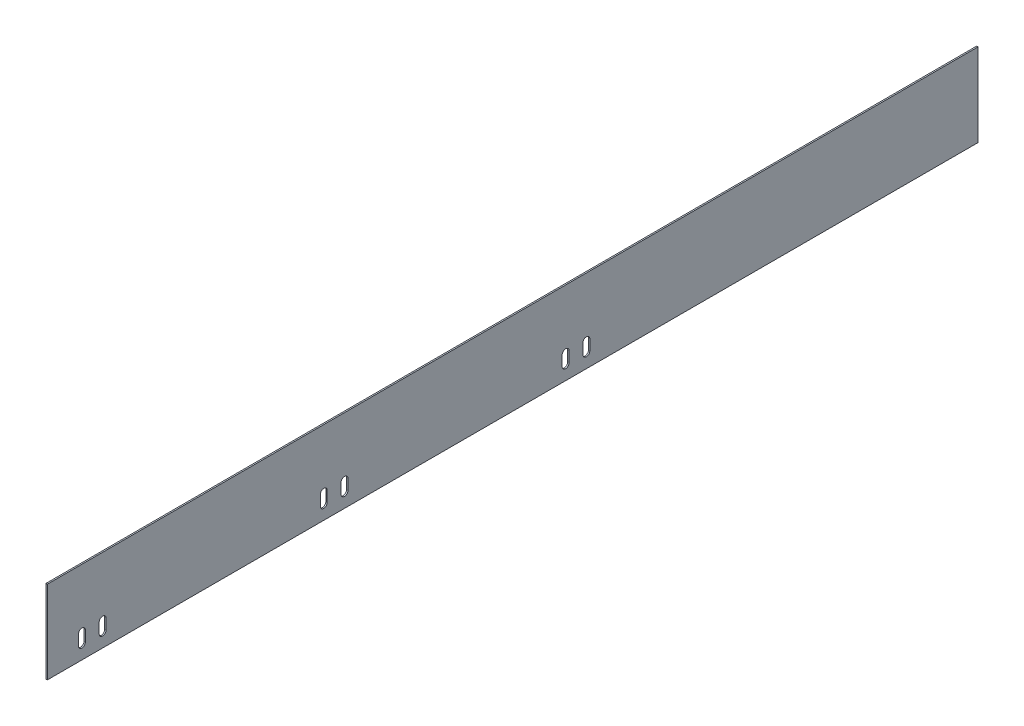
ISO-10303-21;
HEADER;
FILE_DESCRIPTION(('STEP AP214'),'2;1');
FILE_NAME('part.step','',(''),(''),'','','');
FILE_SCHEMA(('AUTOMOTIVE_DESIGN { 1 0 10303 214 1 1 1 1 }'));
ENDSEC;
DATA;
#1=APPLICATION_CONTEXT('core data for automotive mechanical design processes');
#2=APPLICATION_PROTOCOL_DEFINITION('international standard','automotive_design',2000,#1);
#3=PRODUCT_CONTEXT('',#1,'mechanical');
#4=PRODUCT('Part','Part','',(#3));
#5=PRODUCT_RELATED_PRODUCT_CATEGORY('part','',(#4));
#6=PRODUCT_DEFINITION_FORMATION('','',#4);
#7=PRODUCT_DEFINITION_CONTEXT('part definition',#1,'design');
#8=PRODUCT_DEFINITION('design','',#6,#7);
#9=PRODUCT_DEFINITION_SHAPE('','',#8);
#10=(LENGTH_UNIT() NAMED_UNIT(*) SI_UNIT(.MILLI.,.METRE.));
#11=(NAMED_UNIT(*) PLANE_ANGLE_UNIT() SI_UNIT($,.RADIAN.));
#12=(NAMED_UNIT(*) SI_UNIT($,.STERADIAN.) SOLID_ANGLE_UNIT());
#13=UNCERTAINTY_MEASURE_WITH_UNIT(LENGTH_MEASURE(1.E-05),#10,'distance_accuracy_value','');
#14=(GEOMETRIC_REPRESENTATION_CONTEXT(3) GLOBAL_UNCERTAINTY_ASSIGNED_CONTEXT((#13)) GLOBAL_UNIT_ASSIGNED_CONTEXT((#10,
#11,#12)) REPRESENTATION_CONTEXT('',''));
#15=CARTESIAN_POINT('',(0.,0.,0.));
#16=DIRECTION('',(0.,0.,1.));
#17=DIRECTION('',(1.,0.,0.));
#18=AXIS2_PLACEMENT_3D('',#15,#16,#17);
#19=CARTESIAN_POINT('',(1.11022302462516E-13,60.0000000000001,-523.712388980384));
#20=DIRECTION('',(0.,1.,0.));
#21=DIRECTION('',(1.,0.,0.));
#22=AXIS2_PLACEMENT_3D('',#19,#20,#21);
#23=PLANE('',#22);
#24=DIRECTION('',(0.,0.,1.));
#25=VECTOR('',#24,1.);
#26=CARTESIAN_POINT('',(1.11022302462516E-13,60.0000000000001,-523.712388980384));
#27=LINE('',#26,#25);
#28=CARTESIAN_POINT('',(-1.88737914186277E-12,60.0000000000001,-821.712388980384));
#29=VERTEX_POINT('',#28);
#30=CARTESIAN_POINT('',(0.,60.0000000000001,525.000000000001));
#31=VERTEX_POINT('',#30);
#32=EDGE_CURVE('E102',#29,#31,#27,.T.);
#33=ORIENTED_EDGE('',*,*,#32,.T.);
#34=DIRECTION('',(-1.,0.,0.));
#35=VECTOR('',#34,1.);
#36=CARTESIAN_POINT('',(2.,60.0000000000001,525.000000000001));
#37=LINE('',#36,#35);
#38=CARTESIAN_POINT('',(2.,60.0000000000001,525.000000000001));
#39=VERTEX_POINT('',#38);
#40=EDGE_CURVE('E276',#39,#31,#37,.T.);
#41=ORIENTED_EDGE('',*,*,#40,.F.);
#42=DIRECTION('',(0.,0.,-1.));
#43=VECTOR('',#42,1.);
#44=CARTESIAN_POINT('',(2.00000000000011,60.0000000000001,-521.712388980383));
#45=LINE('',#44,#43);
#46=CARTESIAN_POINT('',(1.99999999999811,60.0000000000001,-821.712388980384));
#47=VERTEX_POINT('',#46);
#48=EDGE_CURVE('E269',#47,#39,#45,.F.);
#49=ORIENTED_EDGE('',*,*,#48,.F.);
#50=DIRECTION('',(1.,0.,0.));
#51=VECTOR('',#50,1.);
#52=CARTESIAN_POINT('',(-1.88737914186277E-12,60.0000000000001,-821.712388980384));
#53=LINE('',#52,#51);
#54=EDGE_CURVE('E13',#29,#47,#53,.T.);
#55=ORIENTED_EDGE('',*,*,#54,.F.);
#56=EDGE_LOOP('',(#33,#41,#49,#55));
#57=FACE_BOUND('',#56,.T.);
#58=ADVANCED_FACE('F63',(#57),#23,.T.);
#59=CARTESIAN_POINT('',(-1.88737914186277E-12,-60.0000000000001,-821.712388980384));
#60=DIRECTION('',(0.,-1.,0.));
#61=DIRECTION('',(-1.,0.,0.));
#62=AXIS2_PLACEMENT_3D('',#59,#60,#61);
#63=PLANE('',#62);
#64=DIRECTION('',(0.,0.,1.));
#65=VECTOR('',#64,1.);
#66=CARTESIAN_POINT('',(2.00000000000011,-60.0000000000001,-521.712388980383));
#67=LINE('',#66,#65);
#68=CARTESIAN_POINT('',(2.,-60.0000000000001,525.000000000001));
#69=VERTEX_POINT('',#68);
#70=CARTESIAN_POINT('',(1.99999999999811,-60.0000000000001,-821.712388980384));
#71=VERTEX_POINT('',#70);
#72=EDGE_CURVE('E67',#69,#71,#67,.F.);
#73=ORIENTED_EDGE('',*,*,#72,.F.);
#74=DIRECTION('',(-1.,0.,0.));
#75=VECTOR('',#74,1.);
#76=CARTESIAN_POINT('',(2.,-60.0000000000001,525.000000000001));
#77=LINE('',#76,#75);
#78=CARTESIAN_POINT('',(0.,-60.0000000000001,525.000000000001));
#79=VERTEX_POINT('',#78);
#80=EDGE_CURVE('E275',#69,#79,#77,.T.);
#81=ORIENTED_EDGE('',*,*,#80,.T.);
#82=DIRECTION('',(0.,0.,-1.));
#83=VECTOR('',#82,1.);
#84=CARTESIAN_POINT('',(-1.88737914186277E-12,-60.0000000000001,-821.712388980384));
#85=LINE('',#84,#83);
#86=CARTESIAN_POINT('',(-1.88737914186277E-12,-60.0000000000001,-821.712388980384));
#87=VERTEX_POINT('',#86);
#88=EDGE_CURVE('E260',#79,#87,#85,.T.);
#89=ORIENTED_EDGE('',*,*,#88,.T.);
#90=DIRECTION('',(1.,0.,0.));
#91=VECTOR('',#90,1.);
#92=CARTESIAN_POINT('',(-1.88737914186277E-12,-60.0000000000001,-821.712388980384));
#93=LINE('',#92,#91);
#94=EDGE_CURVE('E74',#87,#71,#93,.T.);
#95=ORIENTED_EDGE('',*,*,#94,.T.);
#96=EDGE_LOOP('',(#73,#81,#89,#95));
#97=FACE_BOUND('',#96,.T.);
#98=ADVANCED_FACE('F279',(#97),#63,.T.);
#99=CARTESIAN_POINT('',(0.,0.,0.));
#100=DIRECTION('',(-1.,0.,0.));
#101=DIRECTION('',(0.,0.,1.));
#102=AXIS2_PLACEMENT_3D('',#99,#100,#101);
#103=PLANE('',#102);
#104=ORIENTED_EDGE('',*,*,#88,.F.);
#105=DIRECTION('',(0.,-1.,0.));
#106=VECTOR('',#105,1.);
#107=CARTESIAN_POINT('',(0.,-60.0000000000001,525.000000000001));
#108=LINE('',#107,#106);
#109=EDGE_CURVE('E263',#31,#79,#108,.T.);
#110=ORIENTED_EDGE('',*,*,#109,.F.);
#111=ORIENTED_EDGE('',*,*,#32,.F.);
#112=DIRECTION('',(0.,1.,0.));
#113=VECTOR('',#112,1.);
#114=CARTESIAN_POINT('',(-1.88737914186277E-12,60.0000000000001,-821.712388980384));
#115=LINE('',#114,#113);
#116=EDGE_CURVE('E264',#87,#29,#115,.T.);
#117=ORIENTED_EDGE('',*,*,#116,.F.);
#118=EDGE_LOOP('',(#104,#110,#111,#117));
#119=FACE_BOUND('',#118,.T.);
#120=CARTESIAN_POINT('',(0.,-25.0000000000001,475.000000000001));
#121=DIRECTION('',(-1.,0.,0.));
#122=DIRECTION('',(0.,0.,1.));
#123=AXIS2_PLACEMENT_3D('',#120,#121,#122);
#124=CIRCLE('',#123,5.);
#125=CARTESIAN_POINT('',(0.,-25.0000000000001,480.000000000001));
#126=VERTEX_POINT('',#125);
#127=CARTESIAN_POINT('',(0.,-25.0000000000001,470.000000000001));
#128=VERTEX_POINT('',#127);
#129=EDGE_CURVE('E298',#126,#128,#124,.T.);
#130=ORIENTED_EDGE('',*,*,#129,.F.);
#131=DIRECTION('',(0.,1.,0.));
#132=VECTOR('',#131,1.);
#133=CARTESIAN_POINT('',(0.,-25.0000000000001,480.000000000001));
#134=LINE('',#133,#132);
#135=CARTESIAN_POINT('',(0.,-40.0000000000001,480.000000000001));
#136=VERTEX_POINT('',#135);
#137=EDGE_CURVE('E286',#136,#126,#134,.T.);
#138=ORIENTED_EDGE('',*,*,#137,.F.);
#139=CARTESIAN_POINT('',(0.,-40.0000000000001,475.000000000001));
#140=DIRECTION('',(-1.,0.,0.));
#141=DIRECTION('',(0.,0.,1.));
#142=AXIS2_PLACEMENT_3D('',#139,#140,#141);
#143=CIRCLE('',#142,5.);
#144=CARTESIAN_POINT('',(0.,-40.0000000000001,470.000000000001));
#145=VERTEX_POINT('',#144);
#146=EDGE_CURVE('E318',#145,#136,#143,.T.);
#147=ORIENTED_EDGE('',*,*,#146,.F.);
#148=DIRECTION('',(0.,-1.,0.));
#149=VECTOR('',#148,1.);
#150=CARTESIAN_POINT('',(0.,-25.0000000000001,470.000000000001));
#151=LINE('',#150,#149);
#152=EDGE_CURVE('E307',#128,#145,#151,.T.);
#153=ORIENTED_EDGE('',*,*,#152,.F.);
#154=EDGE_LOOP('',(#130,#138,#147,#153));
#155=FACE_BOUND('',#154,.T.);
#156=CARTESIAN_POINT('',(0.,-25.0000000000003,445.000000000001));
#157=DIRECTION('',(-1.,0.,0.));
#158=DIRECTION('',(0.,0.,1.));
#159=AXIS2_PLACEMENT_3D('',#156,#157,#158);
#160=CIRCLE('',#159,5.);
#161=CARTESIAN_POINT('',(0.,-25.0000000000003,450.000000000001));
#162=VERTEX_POINT('',#161);
#163=CARTESIAN_POINT('',(0.,-25.0000000000003,440.000000000001));
#164=VERTEX_POINT('',#163);
#165=EDGE_CURVE('E339',#162,#164,#160,.T.);
#166=ORIENTED_EDGE('',*,*,#165,.F.);
#167=DIRECTION('',(0.,1.,0.));
#168=VECTOR('',#167,1.);
#169=CARTESIAN_POINT('',(0.,-25.0000000000003,450.000000000001));
#170=LINE('',#169,#168);
#171=CARTESIAN_POINT('',(0.,-40.0000000000003,450.000000000001));
#172=VERTEX_POINT('',#171);
#173=EDGE_CURVE('E329',#172,#162,#170,.T.);
#174=ORIENTED_EDGE('',*,*,#173,.F.);
#175=CARTESIAN_POINT('',(0.,-40.0000000000003,445.000000000001));
#176=DIRECTION('',(-1.,0.,0.));
#177=DIRECTION('',(0.,0.,1.));
#178=AXIS2_PLACEMENT_3D('',#175,#176,#177);
#179=CIRCLE('',#178,5.);
#180=CARTESIAN_POINT('',(0.,-40.0000000000003,440.000000000001));
#181=VERTEX_POINT('',#180);
#182=EDGE_CURVE('E359',#181,#172,#179,.T.);
#183=ORIENTED_EDGE('',*,*,#182,.F.);
#184=DIRECTION('',(0.,-1.,0.));
#185=VECTOR('',#184,1.);
#186=CARTESIAN_POINT('',(0.,-25.0000000000003,440.000000000001));
#187=LINE('',#186,#185);
#188=EDGE_CURVE('E348',#164,#181,#187,.T.);
#189=ORIENTED_EDGE('',*,*,#188,.F.);
#190=EDGE_LOOP('',(#166,#174,#183,#189));
#191=FACE_BOUND('',#190,.T.);
#192=CARTESIAN_POINT('',(0.,-25.0000000000025,125.000000000001));
#193=DIRECTION('',(-1.,0.,0.));
#194=DIRECTION('',(0.,0.,1.));
#195=AXIS2_PLACEMENT_3D('',#192,#193,#194);
#196=CIRCLE('',#195,5.);
#197=CARTESIAN_POINT('',(0.,-25.0000000000025,130.000000000001));
#198=VERTEX_POINT('',#197);
#199=CARTESIAN_POINT('',(0.,-25.0000000000025,120.000000000001));
#200=VERTEX_POINT('',#199);
#201=EDGE_CURVE('E380',#198,#200,#196,.T.);
#202=ORIENTED_EDGE('',*,*,#201,.F.);
#203=DIRECTION('',(0.,1.,0.));
#204=VECTOR('',#203,1.);
#205=CARTESIAN_POINT('',(0.,-25.0000000000025,130.000000000001));
#206=LINE('',#205,#204);
#207=CARTESIAN_POINT('',(0.,-40.0000000000025,130.000000000001));
#208=VERTEX_POINT('',#207);
#209=EDGE_CURVE('E370',#208,#198,#206,.T.);
#210=ORIENTED_EDGE('',*,*,#209,.F.);
#211=CARTESIAN_POINT('',(0.,-40.0000000000025,125.000000000001));
#212=DIRECTION('',(-1.,0.,0.));
#213=DIRECTION('',(0.,0.,1.));
#214=AXIS2_PLACEMENT_3D('',#211,#212,#213);
#215=CIRCLE('',#214,5.);
#216=CARTESIAN_POINT('',(0.,-40.0000000000025,120.000000000001));
#217=VERTEX_POINT('',#216);
#218=EDGE_CURVE('E400',#217,#208,#215,.T.);
#219=ORIENTED_EDGE('',*,*,#218,.F.);
#220=DIRECTION('',(0.,-1.,0.));
#221=VECTOR('',#220,1.);
#222=CARTESIAN_POINT('',(0.,-25.0000000000025,120.000000000001));
#223=LINE('',#222,#221);
#224=EDGE_CURVE('E389',#200,#217,#223,.T.);
#225=ORIENTED_EDGE('',*,*,#224,.F.);
#226=EDGE_LOOP('',(#202,#210,#219,#225));
#227=FACE_BOUND('',#226,.T.);
#228=CARTESIAN_POINT('',(0.,-25.0000000000027,95.0000000000008));
#229=DIRECTION('',(-1.,0.,0.));
#230=DIRECTION('',(0.,0.,1.));
#231=AXIS2_PLACEMENT_3D('',#228,#229,#230);
#232=CIRCLE('',#231,5.);
#233=CARTESIAN_POINT('',(0.,-25.0000000000027,100.000000000001));
#234=VERTEX_POINT('',#233);
#235=CARTESIAN_POINT('',(0.,-25.0000000000027,90.0000000000007));
#236=VERTEX_POINT('',#235);
#237=EDGE_CURVE('E421',#234,#236,#232,.T.);
#238=ORIENTED_EDGE('',*,*,#237,.F.);
#239=DIRECTION('',(0.,1.,0.));
#240=VECTOR('',#239,1.);
#241=CARTESIAN_POINT('',(0.,-25.0000000000027,100.000000000001));
#242=LINE('',#241,#240);
#243=CARTESIAN_POINT('',(0.,-40.0000000000027,100.000000000001));
#244=VERTEX_POINT('',#243);
#245=EDGE_CURVE('E411',#244,#234,#242,.T.);
#246=ORIENTED_EDGE('',*,*,#245,.F.);
#247=CARTESIAN_POINT('',(0.,-40.0000000000027,95.0000000000008));
#248=DIRECTION('',(-1.,0.,0.));
#249=DIRECTION('',(0.,0.,1.));
#250=AXIS2_PLACEMENT_3D('',#247,#248,#249);
#251=CIRCLE('',#250,5.);
#252=CARTESIAN_POINT('',(0.,-40.0000000000027,90.0000000000007));
#253=VERTEX_POINT('',#252);
#254=EDGE_CURVE('E441',#253,#244,#251,.T.);
#255=ORIENTED_EDGE('',*,*,#254,.F.);
#256=DIRECTION('',(0.,-1.,0.));
#257=VECTOR('',#256,1.);
#258=CARTESIAN_POINT('',(0.,-25.0000000000027,90.0000000000007));
#259=LINE('',#258,#257);
#260=EDGE_CURVE('E430',#236,#253,#259,.T.);
#261=ORIENTED_EDGE('',*,*,#260,.F.);
#262=EDGE_LOOP('',(#238,#246,#255,#261));
#263=FACE_BOUND('',#262,.T.);
#264=CARTESIAN_POINT('',(0.,-25.0000000000049,-224.999999999999));
#265=DIRECTION('',(-1.,0.,0.));
#266=DIRECTION('',(0.,0.,1.));
#267=AXIS2_PLACEMENT_3D('',#264,#265,#266);
#268=CIRCLE('',#267,5.);
#269=CARTESIAN_POINT('',(0.,-25.0000000000049,-219.999999999999));
#270=VERTEX_POINT('',#269);
#271=CARTESIAN_POINT('',(0.,-25.0000000000049,-229.999999999999));
#272=VERTEX_POINT('',#271);
#273=EDGE_CURVE('E462',#270,#272,#268,.T.);
#274=ORIENTED_EDGE('',*,*,#273,.F.);
#275=DIRECTION('',(0.,1.,0.));
#276=VECTOR('',#275,1.);
#277=CARTESIAN_POINT('',(0.,-25.0000000000049,-219.999999999999));
#278=LINE('',#277,#276);
#279=CARTESIAN_POINT('',(0.,-40.0000000000049,-219.999999999999));
#280=VERTEX_POINT('',#279);
#281=EDGE_CURVE('E452',#280,#270,#278,.T.);
#282=ORIENTED_EDGE('',*,*,#281,.F.);
#283=CARTESIAN_POINT('',(0.,-40.0000000000049,-224.999999999999));
#284=DIRECTION('',(-1.,0.,0.));
#285=DIRECTION('',(0.,0.,1.));
#286=AXIS2_PLACEMENT_3D('',#283,#284,#285);
#287=CIRCLE('',#286,5.);
#288=CARTESIAN_POINT('',(0.,-40.0000000000049,-229.999999999999));
#289=VERTEX_POINT('',#288);
#290=EDGE_CURVE('E482',#289,#280,#287,.T.);
#291=ORIENTED_EDGE('',*,*,#290,.F.);
#292=DIRECTION('',(0.,-1.,0.));
#293=VECTOR('',#292,1.);
#294=CARTESIAN_POINT('',(0.,-25.0000000000049,-229.999999999999));
#295=LINE('',#294,#293);
#296=EDGE_CURVE('E471',#272,#289,#295,.T.);
#297=ORIENTED_EDGE('',*,*,#296,.F.);
#298=EDGE_LOOP('',(#274,#282,#291,#297));
#299=FACE_BOUND('',#298,.T.);
#300=CARTESIAN_POINT('',(0.,-25.0000000000052,-254.999999999999));
#301=DIRECTION('',(-1.,0.,0.));
#302=DIRECTION('',(0.,0.,1.));
#303=AXIS2_PLACEMENT_3D('',#300,#301,#302);
#304=CIRCLE('',#303,5.);
#305=CARTESIAN_POINT('',(0.,-25.0000000000052,-249.999999999999));
#306=VERTEX_POINT('',#305);
#307=CARTESIAN_POINT('',(0.,-25.0000000000052,-259.999999999999));
#308=VERTEX_POINT('',#307);
#309=EDGE_CURVE('E503',#306,#308,#304,.T.);
#310=ORIENTED_EDGE('',*,*,#309,.F.);
#311=DIRECTION('',(0.,1.,0.));
#312=VECTOR('',#311,1.);
#313=CARTESIAN_POINT('',(0.,-25.0000000000052,-249.999999999999));
#314=LINE('',#313,#312);
#315=CARTESIAN_POINT('',(0.,-40.0000000000052,-249.999999999999));
#316=VERTEX_POINT('',#315);
#317=EDGE_CURVE('E493',#316,#306,#314,.T.);
#318=ORIENTED_EDGE('',*,*,#317,.F.);
#319=CARTESIAN_POINT('',(0.,-40.0000000000052,-254.999999999999));
#320=DIRECTION('',(-1.,0.,0.));
#321=DIRECTION('',(0.,0.,1.));
#322=AXIS2_PLACEMENT_3D('',#319,#320,#321);
#323=CIRCLE('',#322,5.);
#324=CARTESIAN_POINT('',(0.,-40.0000000000052,-259.999999999999));
#325=VERTEX_POINT('',#324);
#326=EDGE_CURVE('E522',#325,#316,#323,.T.);
#327=ORIENTED_EDGE('',*,*,#326,.F.);
#328=DIRECTION('',(0.,-1.,0.));
#329=VECTOR('',#328,1.);
#330=CARTESIAN_POINT('',(0.,-25.0000000000052,-259.999999999999));
#331=LINE('',#330,#329);
#332=EDGE_CURVE('E512',#308,#325,#331,.T.);
#333=ORIENTED_EDGE('',*,*,#332,.F.);
#334=EDGE_LOOP('',(#310,#318,#327,#333));
#335=FACE_BOUND('',#334,.T.);
#336=ADVANCED_FACE('F65',(#119,#155,#191,#227,#263,#299,#335),#103,.T.);
#337=CARTESIAN_POINT('',(2.00000000000011,0.,-521.712388980383));
#338=DIRECTION('',(-1.,0.,0.));
#339=DIRECTION('',(0.,0.,1.));
#340=AXIS2_PLACEMENT_3D('',#337,#338,#339);
#341=PLANE('',#340);
#342=ORIENTED_EDGE('',*,*,#48,.T.);
#343=DIRECTION('',(0.,-1.,0.));
#344=VECTOR('',#343,1.);
#345=CARTESIAN_POINT('',(2.,-60.0000000000001,525.000000000001));
#346=LINE('',#345,#344);
#347=EDGE_CURVE('E281',#39,#69,#346,.T.);
#348=ORIENTED_EDGE('',*,*,#347,.T.);
#349=ORIENTED_EDGE('',*,*,#72,.T.);
#350=DIRECTION('',(0.,-1.,0.));
#351=VECTOR('',#350,1.);
#352=CARTESIAN_POINT('',(1.99999999999811,0.,-821.712388980384));
#353=LINE('',#352,#351);
#354=EDGE_CURVE('E285',#71,#47,#353,.F.);
#355=ORIENTED_EDGE('',*,*,#354,.T.);
#356=EDGE_LOOP('',(#342,#348,#349,#355));
#357=FACE_BOUND('',#356,.T.);
#358=DIRECTION('',(0.,-1.,0.));
#359=VECTOR('',#358,1.);
#360=CARTESIAN_POINT('',(2.,-25.0000000000001,480.000000000001));
#361=LINE('',#360,#359);
#362=CARTESIAN_POINT('',(2.,-25.0000000000001,480.000000000001));
#363=VERTEX_POINT('',#362);
#364=CARTESIAN_POINT('',(2.,-40.0000000000001,480.000000000001));
#365=VERTEX_POINT('',#364);
#366=EDGE_CURVE('E295',#363,#365,#361,.T.);
#367=ORIENTED_EDGE('',*,*,#366,.F.);
#368=CARTESIAN_POINT('',(2.,-25.0000000000001,475.000000000001));
#369=DIRECTION('',(-1.,0.,0.));
#370=DIRECTION('',(0.,0.,1.));
#371=AXIS2_PLACEMENT_3D('',#368,#369,#370);
#372=CIRCLE('',#371,5.);
#373=CARTESIAN_POINT('',(2.,-25.0000000000001,470.000000000001));
#374=VERTEX_POINT('',#373);
#375=EDGE_CURVE('E304',#374,#363,#372,.F.);
#376=ORIENTED_EDGE('',*,*,#375,.F.);
#377=DIRECTION('',(0.,1.,0.));
#378=VECTOR('',#377,1.);
#379=CARTESIAN_POINT('',(2.,-25.0000000000001,470.000000000001));
#380=LINE('',#379,#378);
#381=CARTESIAN_POINT('',(2.,-40.0000000000001,470.000000000001));
#382=VERTEX_POINT('',#381);
#383=EDGE_CURVE('E315',#382,#374,#380,.T.);
#384=ORIENTED_EDGE('',*,*,#383,.F.);
#385=CARTESIAN_POINT('',(2.,-40.0000000000001,475.000000000001));
#386=DIRECTION('',(-1.,0.,0.));
#387=DIRECTION('',(0.,0.,1.));
#388=AXIS2_PLACEMENT_3D('',#385,#386,#387);
#389=CIRCLE('',#388,5.);
#390=EDGE_CURVE('E325',#365,#382,#389,.F.);
#391=ORIENTED_EDGE('',*,*,#390,.F.);
#392=EDGE_LOOP('',(#367,#376,#384,#391));
#393=FACE_BOUND('',#392,.T.);
#394=DIRECTION('',(0.,-1.,0.));
#395=VECTOR('',#394,1.);
#396=CARTESIAN_POINT('',(2.,-25.0000000000003,450.000000000001));
#397=LINE('',#396,#395);
#398=CARTESIAN_POINT('',(2.,-25.0000000000003,450.000000000001));
#399=VERTEX_POINT('',#398);
#400=CARTESIAN_POINT('',(2.,-40.0000000000003,450.000000000001));
#401=VERTEX_POINT('',#400);
#402=EDGE_CURVE('E336',#399,#401,#397,.T.);
#403=ORIENTED_EDGE('',*,*,#402,.F.);
#404=CARTESIAN_POINT('',(2.,-25.0000000000003,445.000000000001));
#405=DIRECTION('',(-1.,0.,0.));
#406=DIRECTION('',(0.,0.,1.));
#407=AXIS2_PLACEMENT_3D('',#404,#405,#406);
#408=CIRCLE('',#407,5.);
#409=CARTESIAN_POINT('',(2.,-25.0000000000003,440.000000000001));
#410=VERTEX_POINT('',#409);
#411=EDGE_CURVE('E345',#410,#399,#408,.F.);
#412=ORIENTED_EDGE('',*,*,#411,.F.);
#413=DIRECTION('',(0.,1.,0.));
#414=VECTOR('',#413,1.);
#415=CARTESIAN_POINT('',(2.,-25.0000000000003,440.000000000001));
#416=LINE('',#415,#414);
#417=CARTESIAN_POINT('',(2.,-40.0000000000003,440.000000000001));
#418=VERTEX_POINT('',#417);
#419=EDGE_CURVE('E356',#418,#410,#416,.T.);
#420=ORIENTED_EDGE('',*,*,#419,.F.);
#421=CARTESIAN_POINT('',(2.,-40.0000000000003,445.000000000001));
#422=DIRECTION('',(-1.,0.,0.));
#423=DIRECTION('',(0.,0.,1.));
#424=AXIS2_PLACEMENT_3D('',#421,#422,#423);
#425=CIRCLE('',#424,5.);
#426=EDGE_CURVE('E366',#401,#418,#425,.F.);
#427=ORIENTED_EDGE('',*,*,#426,.F.);
#428=EDGE_LOOP('',(#403,#412,#420,#427));
#429=FACE_BOUND('',#428,.T.);
#430=DIRECTION('',(0.,-1.,0.));
#431=VECTOR('',#430,1.);
#432=CARTESIAN_POINT('',(2.,-25.0000000000025,130.000000000001));
#433=LINE('',#432,#431);
#434=CARTESIAN_POINT('',(2.,-25.0000000000025,130.000000000001));
#435=VERTEX_POINT('',#434);
#436=CARTESIAN_POINT('',(2.,-40.0000000000025,130.000000000001));
#437=VERTEX_POINT('',#436);
#438=EDGE_CURVE('E377',#435,#437,#433,.T.);
#439=ORIENTED_EDGE('',*,*,#438,.F.);
#440=CARTESIAN_POINT('',(2.,-25.0000000000025,125.000000000001));
#441=DIRECTION('',(-1.,0.,0.));
#442=DIRECTION('',(0.,0.,1.));
#443=AXIS2_PLACEMENT_3D('',#440,#441,#442);
#444=CIRCLE('',#443,5.);
#445=CARTESIAN_POINT('',(2.,-25.0000000000025,120.000000000001));
#446=VERTEX_POINT('',#445);
#447=EDGE_CURVE('E386',#446,#435,#444,.F.);
#448=ORIENTED_EDGE('',*,*,#447,.F.);
#449=DIRECTION('',(0.,1.,0.));
#450=VECTOR('',#449,1.);
#451=CARTESIAN_POINT('',(2.,-25.0000000000025,120.000000000001));
#452=LINE('',#451,#450);
#453=CARTESIAN_POINT('',(2.,-40.0000000000025,120.000000000001));
#454=VERTEX_POINT('',#453);
#455=EDGE_CURVE('E397',#454,#446,#452,.T.);
#456=ORIENTED_EDGE('',*,*,#455,.F.);
#457=CARTESIAN_POINT('',(2.,-40.0000000000025,125.000000000001));
#458=DIRECTION('',(-1.,0.,0.));
#459=DIRECTION('',(0.,0.,1.));
#460=AXIS2_PLACEMENT_3D('',#457,#458,#459);
#461=CIRCLE('',#460,5.);
#462=EDGE_CURVE('E407',#437,#454,#461,.F.);
#463=ORIENTED_EDGE('',*,*,#462,.F.);
#464=EDGE_LOOP('',(#439,#448,#456,#463));
#465=FACE_BOUND('',#464,.T.);
#466=DIRECTION('',(0.,-1.,0.));
#467=VECTOR('',#466,1.);
#468=CARTESIAN_POINT('',(2.,-25.0000000000027,100.000000000001));
#469=LINE('',#468,#467);
#470=CARTESIAN_POINT('',(2.,-25.0000000000027,100.000000000001));
#471=VERTEX_POINT('',#470);
#472=CARTESIAN_POINT('',(2.,-40.0000000000027,100.000000000001));
#473=VERTEX_POINT('',#472);
#474=EDGE_CURVE('E418',#471,#473,#469,.T.);
#475=ORIENTED_EDGE('',*,*,#474,.F.);
#476=CARTESIAN_POINT('',(2.,-25.0000000000027,95.0000000000008));
#477=DIRECTION('',(-1.,0.,0.));
#478=DIRECTION('',(0.,0.,1.));
#479=AXIS2_PLACEMENT_3D('',#476,#477,#478);
#480=CIRCLE('',#479,5.);
#481=CARTESIAN_POINT('',(2.,-25.0000000000027,90.0000000000007));
#482=VERTEX_POINT('',#481);
#483=EDGE_CURVE('E427',#482,#471,#480,.F.);
#484=ORIENTED_EDGE('',*,*,#483,.F.);
#485=DIRECTION('',(0.,1.,0.));
#486=VECTOR('',#485,1.);
#487=CARTESIAN_POINT('',(2.,-25.0000000000027,90.0000000000007));
#488=LINE('',#487,#486);
#489=CARTESIAN_POINT('',(2.,-40.0000000000027,90.0000000000007));
#490=VERTEX_POINT('',#489);
#491=EDGE_CURVE('E438',#490,#482,#488,.T.);
#492=ORIENTED_EDGE('',*,*,#491,.F.);
#493=CARTESIAN_POINT('',(2.,-40.0000000000027,95.0000000000008));
#494=DIRECTION('',(-1.,0.,0.));
#495=DIRECTION('',(0.,0.,1.));
#496=AXIS2_PLACEMENT_3D('',#493,#494,#495);
#497=CIRCLE('',#496,5.);
#498=EDGE_CURVE('E448',#473,#490,#497,.F.);
#499=ORIENTED_EDGE('',*,*,#498,.F.);
#500=EDGE_LOOP('',(#475,#484,#492,#499));
#501=FACE_BOUND('',#500,.T.);
#502=DIRECTION('',(0.,-1.,0.));
#503=VECTOR('',#502,1.);
#504=CARTESIAN_POINT('',(2.,-25.0000000000049,-219.999999999999));
#505=LINE('',#504,#503);
#506=CARTESIAN_POINT('',(2.,-25.0000000000049,-219.999999999999));
#507=VERTEX_POINT('',#506);
#508=CARTESIAN_POINT('',(2.,-40.0000000000049,-219.999999999999));
#509=VERTEX_POINT('',#508);
#510=EDGE_CURVE('E459',#507,#509,#505,.T.);
#511=ORIENTED_EDGE('',*,*,#510,.F.);
#512=CARTESIAN_POINT('',(2.,-25.0000000000049,-224.999999999999));
#513=DIRECTION('',(-1.,0.,0.));
#514=DIRECTION('',(0.,0.,1.));
#515=AXIS2_PLACEMENT_3D('',#512,#513,#514);
#516=CIRCLE('',#515,5.);
#517=CARTESIAN_POINT('',(2.,-25.0000000000049,-229.999999999999));
#518=VERTEX_POINT('',#517);
#519=EDGE_CURVE('E468',#518,#507,#516,.F.);
#520=ORIENTED_EDGE('',*,*,#519,.F.);
#521=DIRECTION('',(0.,1.,0.));
#522=VECTOR('',#521,1.);
#523=CARTESIAN_POINT('',(2.,-25.0000000000049,-229.999999999999));
#524=LINE('',#523,#522);
#525=CARTESIAN_POINT('',(2.,-40.0000000000049,-229.999999999999));
#526=VERTEX_POINT('',#525);
#527=EDGE_CURVE('E479',#526,#518,#524,.T.);
#528=ORIENTED_EDGE('',*,*,#527,.F.);
#529=CARTESIAN_POINT('',(2.,-40.0000000000049,-224.999999999999));
#530=DIRECTION('',(-1.,0.,0.));
#531=DIRECTION('',(0.,0.,1.));
#532=AXIS2_PLACEMENT_3D('',#529,#530,#531);
#533=CIRCLE('',#532,5.);
#534=EDGE_CURVE('E489',#509,#526,#533,.F.);
#535=ORIENTED_EDGE('',*,*,#534,.F.);
#536=EDGE_LOOP('',(#511,#520,#528,#535));
#537=FACE_BOUND('',#536,.T.);
#538=DIRECTION('',(0.,-1.,0.));
#539=VECTOR('',#538,1.);
#540=CARTESIAN_POINT('',(2.,-25.0000000000052,-249.999999999999));
#541=LINE('',#540,#539);
#542=CARTESIAN_POINT('',(2.,-25.0000000000052,-249.999999999999));
#543=VERTEX_POINT('',#542);
#544=CARTESIAN_POINT('',(2.,-40.0000000000052,-249.999999999999));
#545=VERTEX_POINT('',#544);
#546=EDGE_CURVE('E500',#543,#545,#541,.T.);
#547=ORIENTED_EDGE('',*,*,#546,.F.);
#548=CARTESIAN_POINT('',(2.,-25.0000000000052,-254.999999999999));
#549=DIRECTION('',(-1.,0.,0.));
#550=DIRECTION('',(0.,0.,1.));
#551=AXIS2_PLACEMENT_3D('',#548,#549,#550);
#552=CIRCLE('',#551,5.);
#553=CARTESIAN_POINT('',(2.,-25.0000000000052,-259.999999999999));
#554=VERTEX_POINT('',#553);
#555=EDGE_CURVE('E509',#554,#543,#552,.F.);
#556=ORIENTED_EDGE('',*,*,#555,.F.);
#557=DIRECTION('',(0.,1.,0.));
#558=VECTOR('',#557,1.);
#559=CARTESIAN_POINT('',(2.,-25.0000000000052,-259.999999999999));
#560=LINE('',#559,#558);
#561=CARTESIAN_POINT('',(2.,-40.0000000000052,-259.999999999999));
#562=VERTEX_POINT('',#561);
#563=EDGE_CURVE('E519',#562,#554,#560,.T.);
#564=ORIENTED_EDGE('',*,*,#563,.F.);
#565=CARTESIAN_POINT('',(2.,-40.0000000000052,-254.999999999999));
#566=DIRECTION('',(-1.,0.,0.));
#567=DIRECTION('',(0.,0.,1.));
#568=AXIS2_PLACEMENT_3D('',#565,#566,#567);
#569=CIRCLE('',#568,5.);
#570=EDGE_CURVE('E527',#545,#562,#569,.F.);
#571=ORIENTED_EDGE('',*,*,#570,.F.);
#572=EDGE_LOOP('',(#547,#556,#564,#571));
#573=FACE_BOUND('',#572,.T.);
#574=ADVANCED_FACE('F540',(#357,#393,#429,#465,#501,#537,#573),#341,.F.);
#575=CARTESIAN_POINT('',(-1.88737914186277E-12,60.0000000000001,-821.712388980384));
#576=DIRECTION('',(0.,0.,-1.));
#577=DIRECTION('',(-1.,0.,0.));
#578=AXIS2_PLACEMENT_3D('',#575,#576,#577);
#579=PLANE('',#578);
#580=ORIENTED_EDGE('',*,*,#354,.F.);
#581=ORIENTED_EDGE('',*,*,#94,.F.);
#582=ORIENTED_EDGE('',*,*,#116,.T.);
#583=ORIENTED_EDGE('',*,*,#54,.T.);
#584=EDGE_LOOP('',(#580,#581,#582,#583));
#585=FACE_BOUND('',#584,.T.);
#586=ADVANCED_FACE('F551',(#585),#579,.T.);
#587=CARTESIAN_POINT('',(2.,-60.0000000000001,525.000000000001));
#588=DIRECTION('',(0.,0.,-1.));
#589=DIRECTION('',(-1.,0.,0.));
#590=AXIS2_PLACEMENT_3D('',#587,#588,#589);
#591=PLANE('',#590);
#592=ORIENTED_EDGE('',*,*,#109,.T.);
#593=ORIENTED_EDGE('',*,*,#80,.F.);
#594=ORIENTED_EDGE('',*,*,#347,.F.);
#595=ORIENTED_EDGE('',*,*,#40,.T.);
#596=EDGE_LOOP('',(#592,#593,#594,#595));
#597=FACE_BOUND('',#596,.T.);
#598=ADVANCED_FACE('F273',(#597),#591,.F.);
#599=CARTESIAN_POINT('',(28.9258240356725,-40.0000000000052,-254.999999999999));
#600=DIRECTION('',(-1.,0.,0.));
#601=DIRECTION('',(0.,0.,1.));
#602=AXIS2_PLACEMENT_3D('',#599,#600,#601);
#603=CYLINDRICAL_SURFACE('',#602,5.);
#604=ORIENTED_EDGE('',*,*,#570,.T.);
#605=DIRECTION('',(-1.,0.,0.));
#606=VECTOR('',#605,1.);
#607=CARTESIAN_POINT('',(28.9258240356725,-40.0000000000052,-259.999999999999));
#608=LINE('',#607,#606);
#609=EDGE_CURVE('E254',#562,#325,#608,.T.);
#610=ORIENTED_EDGE('',*,*,#609,.T.);
#611=ORIENTED_EDGE('',*,*,#326,.T.);
#612=DIRECTION('',(-1.,0.,0.));
#613=VECTOR('',#612,1.);
#614=CARTESIAN_POINT('',(28.9258240356725,-40.0000000000052,-249.999999999999));
#615=LINE('',#614,#613);
#616=EDGE_CURVE('E497',#545,#316,#615,.T.);
#617=ORIENTED_EDGE('',*,*,#616,.F.);
#618=EDGE_LOOP('',(#604,#610,#611,#617));
#619=FACE_BOUND('',#618,.T.);
#620=ADVANCED_FACE('F557',(#619),#603,.F.);
#621=CARTESIAN_POINT('',(28.9258240356725,-25.0000000000052,-259.999999999999));
#622=DIRECTION('',(0.,0.,-1.));
#623=DIRECTION('',(-1.,0.,0.));
#624=AXIS2_PLACEMENT_3D('',#621,#622,#623);
#625=PLANE('',#624);
#626=ORIENTED_EDGE('',*,*,#563,.T.);
#627=DIRECTION('',(-1.,0.,0.));
#628=VECTOR('',#627,1.);
#629=CARTESIAN_POINT('',(28.9258240356725,-25.0000000000052,-259.999999999999));
#630=LINE('',#629,#628);
#631=EDGE_CURVE('E515',#554,#308,#630,.T.);
#632=ORIENTED_EDGE('',*,*,#631,.T.);
#633=ORIENTED_EDGE('',*,*,#332,.T.);
#634=ORIENTED_EDGE('',*,*,#609,.F.);
#635=EDGE_LOOP('',(#626,#632,#633,#634));
#636=FACE_BOUND('',#635,.T.);
#637=ADVANCED_FACE('F857',(#636),#625,.F.);
#638=CARTESIAN_POINT('',(28.9258240356725,-25.0000000000052,-254.999999999999));
#639=DIRECTION('',(-1.,0.,0.));
#640=DIRECTION('',(0.,0.,1.));
#641=AXIS2_PLACEMENT_3D('',#638,#639,#640);
#642=CYLINDRICAL_SURFACE('',#641,5.);
#643=ORIENTED_EDGE('',*,*,#555,.T.);
#644=DIRECTION('',(-1.,0.,0.));
#645=VECTOR('',#644,1.);
#646=CARTESIAN_POINT('',(28.9258240356725,-25.0000000000052,-249.999999999999));
#647=LINE('',#646,#645);
#648=EDGE_CURVE('E506',#543,#306,#647,.T.);
#649=ORIENTED_EDGE('',*,*,#648,.T.);
#650=ORIENTED_EDGE('',*,*,#309,.T.);
#651=ORIENTED_EDGE('',*,*,#631,.F.);
#652=EDGE_LOOP('',(#643,#649,#650,#651));
#653=FACE_BOUND('',#652,.T.);
#654=ADVANCED_FACE('F846',(#653),#642,.F.);
#655=CARTESIAN_POINT('',(28.9258240356725,-25.0000000000052,-249.999999999999));
#656=DIRECTION('',(0.,0.,1.));
#657=DIRECTION('',(1.,0.,0.));
#658=AXIS2_PLACEMENT_3D('',#655,#656,#657);
#659=PLANE('',#658);
#660=ORIENTED_EDGE('',*,*,#546,.T.);
#661=ORIENTED_EDGE('',*,*,#616,.T.);
#662=ORIENTED_EDGE('',*,*,#317,.T.);
#663=ORIENTED_EDGE('',*,*,#648,.F.);
#664=EDGE_LOOP('',(#660,#661,#662,#663));
#665=FACE_BOUND('',#664,.T.);
#666=ADVANCED_FACE('F835',(#665),#659,.F.);
#667=CARTESIAN_POINT('',(28.9258240356725,-40.0000000000049,-224.999999999999));
#668=DIRECTION('',(-1.,0.,0.));
#669=DIRECTION('',(0.,0.,1.));
#670=AXIS2_PLACEMENT_3D('',#667,#668,#669);
#671=CYLINDRICAL_SURFACE('',#670,5.);
#672=ORIENTED_EDGE('',*,*,#534,.T.);
#673=DIRECTION('',(-1.,0.,0.));
#674=VECTOR('',#673,1.);
#675=CARTESIAN_POINT('',(28.9258240356725,-40.0000000000049,-229.999999999999));
#676=LINE('',#675,#674);
#677=EDGE_CURVE('E486',#526,#289,#676,.T.);
#678=ORIENTED_EDGE('',*,*,#677,.T.);
#679=ORIENTED_EDGE('',*,*,#290,.T.);
#680=DIRECTION('',(-1.,0.,0.));
#681=VECTOR('',#680,1.);
#682=CARTESIAN_POINT('',(28.9258240356725,-40.0000000000049,-219.999999999999));
#683=LINE('',#682,#681);
#684=EDGE_CURVE('E456',#509,#280,#683,.T.);
#685=ORIENTED_EDGE('',*,*,#684,.F.);
#686=EDGE_LOOP('',(#672,#678,#679,#685));
#687=FACE_BOUND('',#686,.T.);
#688=ADVANCED_FACE('F824',(#687),#671,.F.);
#689=CARTESIAN_POINT('',(28.9258240356725,-25.0000000000049,-229.999999999999));
#690=DIRECTION('',(0.,0.,-1.));
#691=DIRECTION('',(-1.,0.,0.));
#692=AXIS2_PLACEMENT_3D('',#689,#690,#691);
#693=PLANE('',#692);
#694=ORIENTED_EDGE('',*,*,#527,.T.);
#695=DIRECTION('',(-1.,0.,0.));
#696=VECTOR('',#695,1.);
#697=CARTESIAN_POINT('',(28.9258240356725,-25.0000000000049,-229.999999999999));
#698=LINE('',#697,#696);
#699=EDGE_CURVE('E475',#518,#272,#698,.T.);
#700=ORIENTED_EDGE('',*,*,#699,.T.);
#701=ORIENTED_EDGE('',*,*,#296,.T.);
#702=ORIENTED_EDGE('',*,*,#677,.F.);
#703=EDGE_LOOP('',(#694,#700,#701,#702));
#704=FACE_BOUND('',#703,.T.);
#705=ADVANCED_FACE('F813',(#704),#693,.F.);
#706=CARTESIAN_POINT('',(28.9258240356725,-25.0000000000049,-224.999999999999));
#707=DIRECTION('',(-1.,0.,0.));
#708=DIRECTION('',(0.,0.,1.));
#709=AXIS2_PLACEMENT_3D('',#706,#707,#708);
#710=CYLINDRICAL_SURFACE('',#709,5.);
#711=ORIENTED_EDGE('',*,*,#519,.T.);
#712=DIRECTION('',(-1.,0.,0.));
#713=VECTOR('',#712,1.);
#714=CARTESIAN_POINT('',(28.9258240356725,-25.0000000000049,-219.999999999999));
#715=LINE('',#714,#713);
#716=EDGE_CURVE('E465',#507,#270,#715,.T.);
#717=ORIENTED_EDGE('',*,*,#716,.T.);
#718=ORIENTED_EDGE('',*,*,#273,.T.);
#719=ORIENTED_EDGE('',*,*,#699,.F.);
#720=EDGE_LOOP('',(#711,#717,#718,#719));
#721=FACE_BOUND('',#720,.T.);
#722=ADVANCED_FACE('F802',(#721),#710,.F.);
#723=CARTESIAN_POINT('',(28.9258240356725,-25.0000000000049,-219.999999999999));
#724=DIRECTION('',(0.,0.,1.));
#725=DIRECTION('',(1.,0.,0.));
#726=AXIS2_PLACEMENT_3D('',#723,#724,#725);
#727=PLANE('',#726);
#728=ORIENTED_EDGE('',*,*,#510,.T.);
#729=ORIENTED_EDGE('',*,*,#684,.T.);
#730=ORIENTED_EDGE('',*,*,#281,.T.);
#731=ORIENTED_EDGE('',*,*,#716,.F.);
#732=EDGE_LOOP('',(#728,#729,#730,#731));
#733=FACE_BOUND('',#732,.T.);
#734=ADVANCED_FACE('F791',(#733),#727,.F.);
#735=CARTESIAN_POINT('',(28.9258240356725,-40.0000000000027,95.0000000000008));
#736=DIRECTION('',(-1.,0.,0.));
#737=DIRECTION('',(0.,0.,1.));
#738=AXIS2_PLACEMENT_3D('',#735,#736,#737);
#739=CYLINDRICAL_SURFACE('',#738,5.);
#740=ORIENTED_EDGE('',*,*,#498,.T.);
#741=DIRECTION('',(-1.,0.,0.));
#742=VECTOR('',#741,1.);
#743=CARTESIAN_POINT('',(28.9258240356725,-40.0000000000027,90.0000000000007));
#744=LINE('',#743,#742);
#745=EDGE_CURVE('E445',#490,#253,#744,.T.);
#746=ORIENTED_EDGE('',*,*,#745,.T.);
#747=ORIENTED_EDGE('',*,*,#254,.T.);
#748=DIRECTION('',(-1.,0.,0.));
#749=VECTOR('',#748,1.);
#750=CARTESIAN_POINT('',(28.9258240356725,-40.0000000000027,100.000000000001));
#751=LINE('',#750,#749);
#752=EDGE_CURVE('E415',#473,#244,#751,.T.);
#753=ORIENTED_EDGE('',*,*,#752,.F.);
#754=EDGE_LOOP('',(#740,#746,#747,#753));
#755=FACE_BOUND('',#754,.T.);
#756=ADVANCED_FACE('F780',(#755),#739,.F.);
#757=CARTESIAN_POINT('',(28.9258240356725,-25.0000000000027,90.0000000000007));
#758=DIRECTION('',(0.,0.,-1.));
#759=DIRECTION('',(-1.,0.,0.));
#760=AXIS2_PLACEMENT_3D('',#757,#758,#759);
#761=PLANE('',#760);
#762=ORIENTED_EDGE('',*,*,#491,.T.);
#763=DIRECTION('',(-1.,0.,0.));
#764=VECTOR('',#763,1.);
#765=CARTESIAN_POINT('',(28.9258240356725,-25.0000000000027,90.0000000000007));
#766=LINE('',#765,#764);
#767=EDGE_CURVE('E434',#482,#236,#766,.T.);
#768=ORIENTED_EDGE('',*,*,#767,.T.);
#769=ORIENTED_EDGE('',*,*,#260,.T.);
#770=ORIENTED_EDGE('',*,*,#745,.F.);
#771=EDGE_LOOP('',(#762,#768,#769,#770));
#772=FACE_BOUND('',#771,.T.);
#773=ADVANCED_FACE('F769',(#772),#761,.F.);
#774=CARTESIAN_POINT('',(28.9258240356725,-25.0000000000027,95.0000000000008));
#775=DIRECTION('',(-1.,0.,0.));
#776=DIRECTION('',(0.,0.,1.));
#777=AXIS2_PLACEMENT_3D('',#774,#775,#776);
#778=CYLINDRICAL_SURFACE('',#777,5.);
#779=ORIENTED_EDGE('',*,*,#483,.T.);
#780=DIRECTION('',(-1.,0.,0.));
#781=VECTOR('',#780,1.);
#782=CARTESIAN_POINT('',(28.9258240356725,-25.0000000000027,100.000000000001));
#783=LINE('',#782,#781);
#784=EDGE_CURVE('E424',#471,#234,#783,.T.);
#785=ORIENTED_EDGE('',*,*,#784,.T.);
#786=ORIENTED_EDGE('',*,*,#237,.T.);
#787=ORIENTED_EDGE('',*,*,#767,.F.);
#788=EDGE_LOOP('',(#779,#785,#786,#787));
#789=FACE_BOUND('',#788,.T.);
#790=ADVANCED_FACE('F758',(#789),#778,.F.);
#791=CARTESIAN_POINT('',(28.9258240356725,-25.0000000000027,100.000000000001));
#792=DIRECTION('',(0.,0.,1.));
#793=DIRECTION('',(1.,0.,0.));
#794=AXIS2_PLACEMENT_3D('',#791,#792,#793);
#795=PLANE('',#794);
#796=ORIENTED_EDGE('',*,*,#474,.T.);
#797=ORIENTED_EDGE('',*,*,#752,.T.);
#798=ORIENTED_EDGE('',*,*,#245,.T.);
#799=ORIENTED_EDGE('',*,*,#784,.F.);
#800=EDGE_LOOP('',(#796,#797,#798,#799));
#801=FACE_BOUND('',#800,.T.);
#802=ADVANCED_FACE('F747',(#801),#795,.F.);
#803=CARTESIAN_POINT('',(28.9258240356725,-40.0000000000025,125.000000000001));
#804=DIRECTION('',(-1.,0.,0.));
#805=DIRECTION('',(0.,0.,1.));
#806=AXIS2_PLACEMENT_3D('',#803,#804,#805);
#807=CYLINDRICAL_SURFACE('',#806,5.);
#808=ORIENTED_EDGE('',*,*,#462,.T.);
#809=DIRECTION('',(-1.,0.,0.));
#810=VECTOR('',#809,1.);
#811=CARTESIAN_POINT('',(28.9258240356725,-40.0000000000025,120.000000000001));
#812=LINE('',#811,#810);
#813=EDGE_CURVE('E404',#454,#217,#812,.T.);
#814=ORIENTED_EDGE('',*,*,#813,.T.);
#815=ORIENTED_EDGE('',*,*,#218,.T.);
#816=DIRECTION('',(-1.,0.,0.));
#817=VECTOR('',#816,1.);
#818=CARTESIAN_POINT('',(28.9258240356725,-40.0000000000025,130.000000000001));
#819=LINE('',#818,#817);
#820=EDGE_CURVE('E374',#437,#208,#819,.T.);
#821=ORIENTED_EDGE('',*,*,#820,.F.);
#822=EDGE_LOOP('',(#808,#814,#815,#821));
#823=FACE_BOUND('',#822,.T.);
#824=ADVANCED_FACE('F736',(#823),#807,.F.);
#825=CARTESIAN_POINT('',(28.9258240356725,-25.0000000000025,120.000000000001));
#826=DIRECTION('',(0.,0.,-1.));
#827=DIRECTION('',(-1.,0.,0.));
#828=AXIS2_PLACEMENT_3D('',#825,#826,#827);
#829=PLANE('',#828);
#830=ORIENTED_EDGE('',*,*,#455,.T.);
#831=DIRECTION('',(-1.,0.,0.));
#832=VECTOR('',#831,1.);
#833=CARTESIAN_POINT('',(28.9258240356725,-25.0000000000025,120.000000000001));
#834=LINE('',#833,#832);
#835=EDGE_CURVE('E393',#446,#200,#834,.T.);
#836=ORIENTED_EDGE('',*,*,#835,.T.);
#837=ORIENTED_EDGE('',*,*,#224,.T.);
#838=ORIENTED_EDGE('',*,*,#813,.F.);
#839=EDGE_LOOP('',(#830,#836,#837,#838));
#840=FACE_BOUND('',#839,.T.);
#841=ADVANCED_FACE('F725',(#840),#829,.F.);
#842=CARTESIAN_POINT('',(28.9258240356725,-25.0000000000025,125.000000000001));
#843=DIRECTION('',(-1.,0.,0.));
#844=DIRECTION('',(0.,0.,1.));
#845=AXIS2_PLACEMENT_3D('',#842,#843,#844);
#846=CYLINDRICAL_SURFACE('',#845,5.);
#847=ORIENTED_EDGE('',*,*,#447,.T.);
#848=DIRECTION('',(-1.,0.,0.));
#849=VECTOR('',#848,1.);
#850=CARTESIAN_POINT('',(28.9258240356725,-25.0000000000025,130.000000000001));
#851=LINE('',#850,#849);
#852=EDGE_CURVE('E383',#435,#198,#851,.T.);
#853=ORIENTED_EDGE('',*,*,#852,.T.);
#854=ORIENTED_EDGE('',*,*,#201,.T.);
#855=ORIENTED_EDGE('',*,*,#835,.F.);
#856=EDGE_LOOP('',(#847,#853,#854,#855));
#857=FACE_BOUND('',#856,.T.);
#858=ADVANCED_FACE('F714',(#857),#846,.F.);
#859=CARTESIAN_POINT('',(28.9258240356725,-25.0000000000025,130.000000000001));
#860=DIRECTION('',(0.,0.,1.));
#861=DIRECTION('',(1.,0.,0.));
#862=AXIS2_PLACEMENT_3D('',#859,#860,#861);
#863=PLANE('',#862);
#864=ORIENTED_EDGE('',*,*,#438,.T.);
#865=ORIENTED_EDGE('',*,*,#820,.T.);
#866=ORIENTED_EDGE('',*,*,#209,.T.);
#867=ORIENTED_EDGE('',*,*,#852,.F.);
#868=EDGE_LOOP('',(#864,#865,#866,#867));
#869=FACE_BOUND('',#868,.T.);
#870=ADVANCED_FACE('F703',(#869),#863,.F.);
#871=CARTESIAN_POINT('',(28.9258240356725,-40.0000000000003,445.000000000001));
#872=DIRECTION('',(-1.,0.,0.));
#873=DIRECTION('',(0.,0.,1.));
#874=AXIS2_PLACEMENT_3D('',#871,#872,#873);
#875=CYLINDRICAL_SURFACE('',#874,5.);
#876=ORIENTED_EDGE('',*,*,#426,.T.);
#877=DIRECTION('',(-1.,0.,0.));
#878=VECTOR('',#877,1.);
#879=CARTESIAN_POINT('',(28.9258240356725,-40.0000000000003,440.000000000001));
#880=LINE('',#879,#878);
#881=EDGE_CURVE('E363',#418,#181,#880,.T.);
#882=ORIENTED_EDGE('',*,*,#881,.T.);
#883=ORIENTED_EDGE('',*,*,#182,.T.);
#884=DIRECTION('',(-1.,0.,0.));
#885=VECTOR('',#884,1.);
#886=CARTESIAN_POINT('',(28.9258240356725,-40.0000000000003,450.000000000001));
#887=LINE('',#886,#885);
#888=EDGE_CURVE('E333',#401,#172,#887,.T.);
#889=ORIENTED_EDGE('',*,*,#888,.F.);
#890=EDGE_LOOP('',(#876,#882,#883,#889));
#891=FACE_BOUND('',#890,.T.);
#892=ADVANCED_FACE('F692',(#891),#875,.F.);
#893=CARTESIAN_POINT('',(28.9258240356725,-25.0000000000003,440.000000000001));
#894=DIRECTION('',(0.,0.,-1.));
#895=DIRECTION('',(-1.,0.,0.));
#896=AXIS2_PLACEMENT_3D('',#893,#894,#895);
#897=PLANE('',#896);
#898=ORIENTED_EDGE('',*,*,#419,.T.);
#899=DIRECTION('',(-1.,0.,0.));
#900=VECTOR('',#899,1.);
#901=CARTESIAN_POINT('',(28.9258240356725,-25.0000000000003,440.000000000001));
#902=LINE('',#901,#900);
#903=EDGE_CURVE('E352',#410,#164,#902,.T.);
#904=ORIENTED_EDGE('',*,*,#903,.T.);
#905=ORIENTED_EDGE('',*,*,#188,.T.);
#906=ORIENTED_EDGE('',*,*,#881,.F.);
#907=EDGE_LOOP('',(#898,#904,#905,#906));
#908=FACE_BOUND('',#907,.T.);
#909=ADVANCED_FACE('F681',(#908),#897,.F.);
#910=CARTESIAN_POINT('',(28.9258240356725,-25.0000000000003,445.000000000001));
#911=DIRECTION('',(-1.,0.,0.));
#912=DIRECTION('',(0.,0.,1.));
#913=AXIS2_PLACEMENT_3D('',#910,#911,#912);
#914=CYLINDRICAL_SURFACE('',#913,5.);
#915=ORIENTED_EDGE('',*,*,#411,.T.);
#916=DIRECTION('',(-1.,0.,0.));
#917=VECTOR('',#916,1.);
#918=CARTESIAN_POINT('',(28.9258240356725,-25.0000000000003,450.000000000001));
#919=LINE('',#918,#917);
#920=EDGE_CURVE('E342',#399,#162,#919,.T.);
#921=ORIENTED_EDGE('',*,*,#920,.T.);
#922=ORIENTED_EDGE('',*,*,#165,.T.);
#923=ORIENTED_EDGE('',*,*,#903,.F.);
#924=EDGE_LOOP('',(#915,#921,#922,#923));
#925=FACE_BOUND('',#924,.T.);
#926=ADVANCED_FACE('F670',(#925),#914,.F.);
#927=CARTESIAN_POINT('',(28.9258240356725,-25.0000000000003,450.000000000001));
#928=DIRECTION('',(0.,0.,1.));
#929=DIRECTION('',(1.,0.,0.));
#930=AXIS2_PLACEMENT_3D('',#927,#928,#929);
#931=PLANE('',#930);
#932=ORIENTED_EDGE('',*,*,#402,.T.);
#933=ORIENTED_EDGE('',*,*,#888,.T.);
#934=ORIENTED_EDGE('',*,*,#173,.T.);
#935=ORIENTED_EDGE('',*,*,#920,.F.);
#936=EDGE_LOOP('',(#932,#933,#934,#935));
#937=FACE_BOUND('',#936,.T.);
#938=ADVANCED_FACE('F659',(#937),#931,.F.);
#939=CARTESIAN_POINT('',(28.9258240356725,-40.0000000000001,475.000000000001));
#940=DIRECTION('',(-1.,0.,0.));
#941=DIRECTION('',(0.,0.,1.));
#942=AXIS2_PLACEMENT_3D('',#939,#940,#941);
#943=CYLINDRICAL_SURFACE('',#942,5.);
#944=ORIENTED_EDGE('',*,*,#390,.T.);
#945=DIRECTION('',(-1.,0.,0.));
#946=VECTOR('',#945,1.);
#947=CARTESIAN_POINT('',(28.9258240356725,-40.0000000000001,470.000000000001));
#948=LINE('',#947,#946);
#949=EDGE_CURVE('E322',#382,#145,#948,.T.);
#950=ORIENTED_EDGE('',*,*,#949,.T.);
#951=ORIENTED_EDGE('',*,*,#146,.T.);
#952=DIRECTION('',(-1.,0.,0.));
#953=VECTOR('',#952,1.);
#954=CARTESIAN_POINT('',(28.9258240356725,-40.0000000000001,480.000000000001));
#955=LINE('',#954,#953);
#956=EDGE_CURVE('E292',#365,#136,#955,.T.);
#957=ORIENTED_EDGE('',*,*,#956,.F.);
#958=EDGE_LOOP('',(#944,#950,#951,#957));
#959=FACE_BOUND('',#958,.T.);
#960=ADVANCED_FACE('F648',(#959),#943,.F.);
#961=CARTESIAN_POINT('',(28.9258240356725,-25.0000000000001,470.000000000001));
#962=DIRECTION('',(0.,0.,-1.));
#963=DIRECTION('',(-1.,0.,0.));
#964=AXIS2_PLACEMENT_3D('',#961,#962,#963);
#965=PLANE('',#964);
#966=ORIENTED_EDGE('',*,*,#383,.T.);
#967=DIRECTION('',(-1.,0.,0.));
#968=VECTOR('',#967,1.);
#969=CARTESIAN_POINT('',(28.9258240356725,-25.0000000000001,470.000000000001));
#970=LINE('',#969,#968);
#971=EDGE_CURVE('E311',#374,#128,#970,.T.);
#972=ORIENTED_EDGE('',*,*,#971,.T.);
#973=ORIENTED_EDGE('',*,*,#152,.T.);
#974=ORIENTED_EDGE('',*,*,#949,.F.);
#975=EDGE_LOOP('',(#966,#972,#973,#974));
#976=FACE_BOUND('',#975,.T.);
#977=ADVANCED_FACE('F637',(#976),#965,.F.);
#978=CARTESIAN_POINT('',(28.9258240356725,-25.0000000000001,475.000000000001));
#979=DIRECTION('',(-1.,0.,0.));
#980=DIRECTION('',(0.,0.,1.));
#981=AXIS2_PLACEMENT_3D('',#978,#979,#980);
#982=CYLINDRICAL_SURFACE('',#981,5.);
#983=ORIENTED_EDGE('',*,*,#375,.T.);
#984=DIRECTION('',(-1.,0.,0.));
#985=VECTOR('',#984,1.);
#986=CARTESIAN_POINT('',(28.9258240356725,-25.0000000000001,480.000000000001));
#987=LINE('',#986,#985);
#988=EDGE_CURVE('E301',#363,#126,#987,.T.);
#989=ORIENTED_EDGE('',*,*,#988,.T.);
#990=ORIENTED_EDGE('',*,*,#129,.T.);
#991=ORIENTED_EDGE('',*,*,#971,.F.);
#992=EDGE_LOOP('',(#983,#989,#990,#991));
#993=FACE_BOUND('',#992,.T.);
#994=ADVANCED_FACE('F627',(#993),#982,.F.);
#995=CARTESIAN_POINT('',(28.9258240356725,-25.0000000000001,480.000000000001));
#996=DIRECTION('',(0.,0.,1.));
#997=DIRECTION('',(1.,0.,0.));
#998=AXIS2_PLACEMENT_3D('',#995,#996,#997);
#999=PLANE('',#998);
#1000=ORIENTED_EDGE('',*,*,#366,.T.);
#1001=ORIENTED_EDGE('',*,*,#956,.T.);
#1002=ORIENTED_EDGE('',*,*,#137,.T.);
#1003=ORIENTED_EDGE('',*,*,#988,.F.);
#1004=EDGE_LOOP('',(#1000,#1001,#1002,#1003));
#1005=FACE_BOUND('',#1004,.T.);
#1006=ADVANCED_FACE('F622',(#1005),#999,.F.);
#1007=CLOSED_SHELL('',(#58,#98,#336,#574,#586,#598,#620,#637,#654,#666,#688,#705,#722,#734,#756,
#773,#790,#802,#824,#841,#858,#870,#892,#909,#926,#938,#960,#977,#994,#1006));
#1008=MANIFOLD_SOLID_BREP('B2',#1007);
#1009=ADVANCED_BREP_SHAPE_REPRESENTATION('',(#18,#1008),#14);
#1010=SHAPE_DEFINITION_REPRESENTATION(#9,#1009);
ENDSEC;
END-ISO-10303-21;
